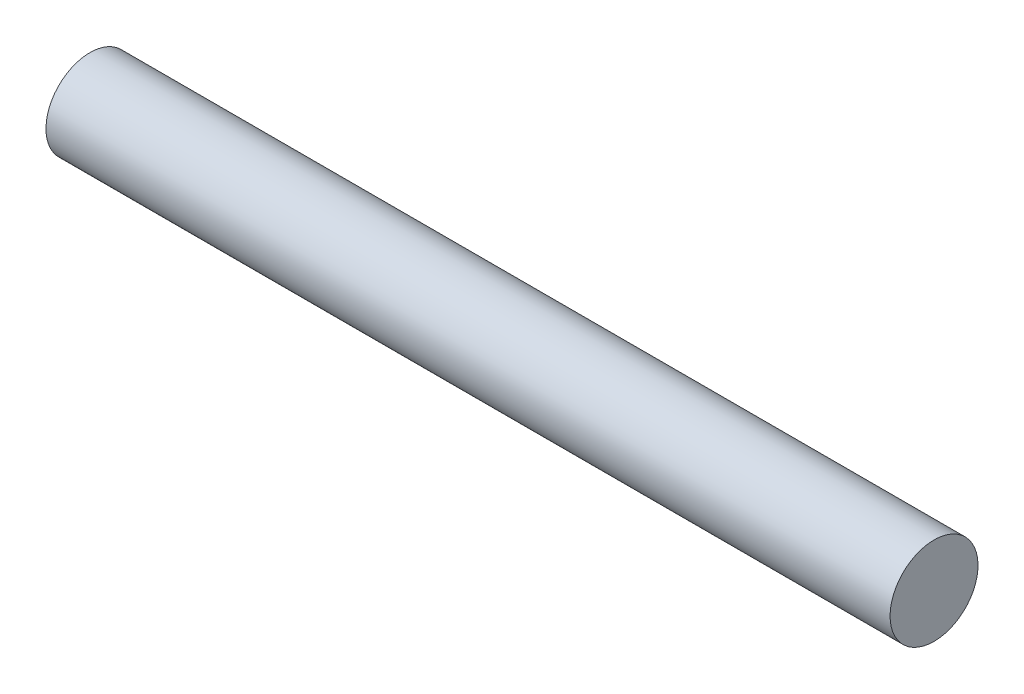
ISO-10303-21;
HEADER;
FILE_DESCRIPTION(('STEP AP214'),'2;1');
FILE_NAME('part.step','',(''),(''),'','','');
FILE_SCHEMA(('AUTOMOTIVE_DESIGN { 1 0 10303 214 1 1 1 1 }'));
ENDSEC;
DATA;
#1=APPLICATION_CONTEXT('core data for automotive mechanical design processes');
#2=APPLICATION_PROTOCOL_DEFINITION('international standard','automotive_design',2000,#1);
#3=PRODUCT_CONTEXT('',#1,'mechanical');
#4=PRODUCT('Part','Part','',(#3));
#5=PRODUCT_RELATED_PRODUCT_CATEGORY('part','',(#4));
#6=PRODUCT_DEFINITION_FORMATION('','',#4);
#7=PRODUCT_DEFINITION_CONTEXT('part definition',#1,'design');
#8=PRODUCT_DEFINITION('design','',#6,#7);
#9=PRODUCT_DEFINITION_SHAPE('','',#8);
#10=(LENGTH_UNIT() NAMED_UNIT(*) SI_UNIT(.MILLI.,.METRE.));
#11=(NAMED_UNIT(*) PLANE_ANGLE_UNIT() SI_UNIT($,.RADIAN.));
#12=(NAMED_UNIT(*) SI_UNIT($,.STERADIAN.) SOLID_ANGLE_UNIT());
#13=UNCERTAINTY_MEASURE_WITH_UNIT(LENGTH_MEASURE(1.E-05),#10,'distance_accuracy_value','');
#14=(GEOMETRIC_REPRESENTATION_CONTEXT(3) GLOBAL_UNCERTAINTY_ASSIGNED_CONTEXT((#13)) GLOBAL_UNIT_ASSIGNED_CONTEXT((#10,
#11,#12)) REPRESENTATION_CONTEXT('',''));
#15=CARTESIAN_POINT('',(0.,0.,0.));
#16=DIRECTION('',(0.,0.,1.));
#17=DIRECTION('',(1.,0.,0.));
#18=AXIS2_PLACEMENT_3D('',#15,#16,#17);
#19=CARTESIAN_POINT('',(-85.8469387755102,3.18877551020408,0.));
#20=DIRECTION('',(-1.,0.,0.));
#21=DIRECTION('',(0.,-1.,0.));
#22=AXIS2_PLACEMENT_3D('',#19,#20,#21);
#23=PLANE('',#22);
#24=CARTESIAN_POINT('',(-85.8469387755102,3.18877551020408,0.));
#25=DIRECTION('',(-1.,0.,0.));
#26=DIRECTION('',(0.,-1.,0.));
#27=AXIS2_PLACEMENT_3D('',#24,#25,#26);
#28=CIRCLE('',#27,5.);
#29=CARTESIAN_POINT('',(-85.8469387755102,-1.81122448979592,0.));
#30=VERTEX_POINT('',#29);
#31=EDGE_CURVE('E10',#30,#30,#28,.T.);
#32=ORIENTED_EDGE('',*,*,#31,.T.);
#33=EDGE_LOOP('',(#32));
#34=FACE_BOUND('',#33,.T.);
#35=ADVANCED_FACE('F31',(#34),#23,.T.);
#36=CARTESIAN_POINT('',(-85.8469387755102,3.18877551020408,0.));
#37=DIRECTION('',(-1.,0.,0.));
#38=DIRECTION('',(0.,-1.,0.));
#39=AXIS2_PLACEMENT_3D('',#36,#37,#38);
#40=CYLINDRICAL_SURFACE('',#39,5.);
#41=CARTESIAN_POINT('',(10.1530612244898,3.18877551020408,0.));
#42=DIRECTION('',(-1.,0.,0.));
#43=DIRECTION('',(0.,-1.,0.));
#44=AXIS2_PLACEMENT_3D('',#41,#42,#43);
#45=CIRCLE('',#44,5.);
#46=CARTESIAN_POINT('',(10.1530612244898,-1.81122448979592,0.));
#47=VERTEX_POINT('',#46);
#48=EDGE_CURVE('E37',#47,#47,#45,.T.);
#49=ORIENTED_EDGE('',*,*,#48,.T.);
#50=EDGE_LOOP('',(#49));
#51=FACE_BOUND('',#50,.T.);
#52=ORIENTED_EDGE('',*,*,#31,.F.);
#53=EDGE_LOOP('',(#52));
#54=FACE_BOUND('',#53,.T.);
#55=ADVANCED_FACE('F43',(#51,#54),#40,.T.);
#56=CARTESIAN_POINT('',(10.1530612244898,3.18877551020408,0.));
#57=DIRECTION('',(1.,0.,0.));
#58=DIRECTION('',(0.,1.,0.));
#59=AXIS2_PLACEMENT_3D('',#56,#57,#58);
#60=PLANE('',#59);
#61=ORIENTED_EDGE('',*,*,#48,.F.);
#62=EDGE_LOOP('',(#61));
#63=FACE_BOUND('',#62,.T.);
#64=ADVANCED_FACE('F46',(#63),#60,.T.);
#65=CLOSED_SHELL('',(#35,#55,#64));
#66=MANIFOLD_SOLID_BREP('B2',#65);
#67=ADVANCED_BREP_SHAPE_REPRESENTATION('',(#18,#66),#14);
#68=SHAPE_DEFINITION_REPRESENTATION(#9,#67);
ENDSEC;
END-ISO-10303-21;
